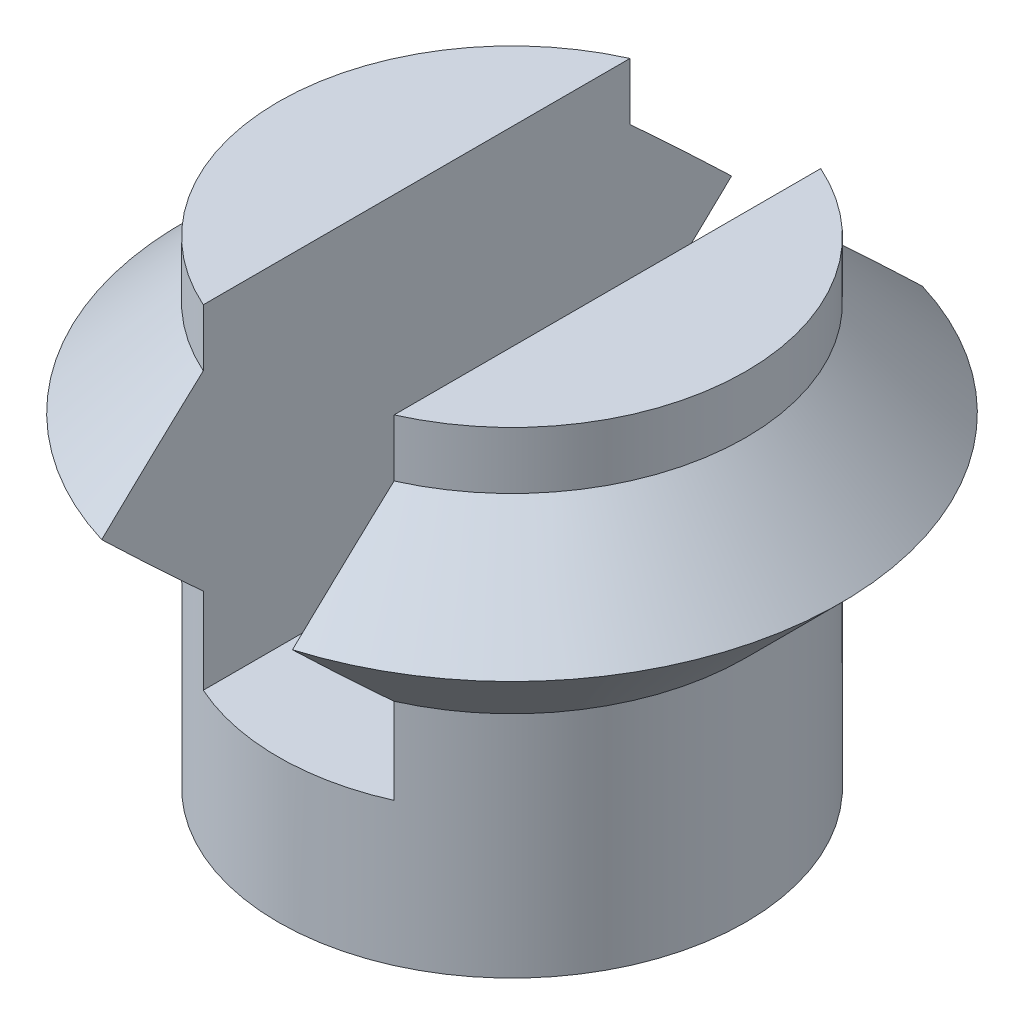
ISO-10303-21;
HEADER;
FILE_DESCRIPTION(('STEP AP214'),'2;1');
FILE_NAME('part.step','',(''),(''),'','','');
FILE_SCHEMA(('AUTOMOTIVE_DESIGN { 1 0 10303 214 1 1 1 1 }'));
ENDSEC;
DATA;
#1=APPLICATION_CONTEXT('core data for automotive mechanical design processes');
#2=APPLICATION_PROTOCOL_DEFINITION('international standard','automotive_design',2000,#1);
#3=PRODUCT_CONTEXT('',#1,'mechanical');
#4=PRODUCT('Part','Part','',(#3));
#5=PRODUCT_RELATED_PRODUCT_CATEGORY('part','',(#4));
#6=PRODUCT_DEFINITION_FORMATION('','',#4);
#7=PRODUCT_DEFINITION_CONTEXT('part definition',#1,'design');
#8=PRODUCT_DEFINITION('design','',#6,#7);
#9=PRODUCT_DEFINITION_SHAPE('','',#8);
#10=(LENGTH_UNIT() NAMED_UNIT(*) SI_UNIT(.MILLI.,.METRE.));
#11=(NAMED_UNIT(*) PLANE_ANGLE_UNIT() SI_UNIT($,.RADIAN.));
#12=(NAMED_UNIT(*) SI_UNIT($,.STERADIAN.) SOLID_ANGLE_UNIT());
#13=UNCERTAINTY_MEASURE_WITH_UNIT(LENGTH_MEASURE(1.E-05),#10,'distance_accuracy_value','');
#14=(GEOMETRIC_REPRESENTATION_CONTEXT(3) GLOBAL_UNCERTAINTY_ASSIGNED_CONTEXT((#13)) GLOBAL_UNIT_ASSIGNED_CONTEXT((#10,
#11,#12)) REPRESENTATION_CONTEXT('',''));
#15=CARTESIAN_POINT('',(0.,0.,0.));
#16=DIRECTION('',(0.,0.,1.));
#17=DIRECTION('',(1.,0.,0.));
#18=AXIS2_PLACEMENT_3D('',#15,#16,#17);
#19=CARTESIAN_POINT('',(0.,6.80000000000001,0.));
#20=DIRECTION('',(0.,1.,0.));
#21=DIRECTION('',(0.,0.,1.));
#22=AXIS2_PLACEMENT_3D('',#19,#20,#21);
#23=CONICAL_SURFACE('',#22,6.9,0.78539816339745);
#24=CARTESIAN_POINT('',(0.,6.80000000000001,0.));
#25=DIRECTION('',(0.,-1.,0.));
#26=DIRECTION('',(0.,0.,-1.));
#27=AXIS2_PLACEMENT_3D('',#24,#25,#26);
#28=CIRCLE('',#27,6.9);
#29=CARTESIAN_POINT('',(-2.,6.80000000000001,6.60378679243962));
#30=VERTEX_POINT('',#29);
#31=CARTESIAN_POINT('',(-2.,6.80000000000001,-6.60378679243962));
#32=VERTEX_POINT('',#31);
#33=EDGE_CURVE('E217',#30,#32,#28,.T.);
#34=ORIENTED_EDGE('',*,*,#33,.T.);
#35=CARTESIAN_POINT('',(-2.,15.1667046465056,-15.1351336552948));
#36=CARTESIAN_POINT('',(-2.,14.7150856370467,-14.6795690612317));
#37=CARTESIAN_POINT('',(-2.,14.2636244457039,-14.2238476741489));
#38=CARTESIAN_POINT('',(-2.,13.361023948662,-13.3117848491264));
#39=CARTESIAN_POINT('',(-2.,12.9098848009211,-12.855443254885));
#40=CARTESIAN_POINT('',(-2.,12.0052993208266,-11.9391624752148));
#41=CARTESIAN_POINT('',(-2.,11.5518571075783,-11.4792192221261));
#42=CARTESIAN_POINT('',(-2.,10.6460268222053,-10.5585938410006));
#43=CARTESIAN_POINT('',(-2.,10.1936384516684,-10.0979120067777));
#44=CARTESIAN_POINT('',(-2.,9.44470472555075,-9.33301483473547));
#45=CARTESIAN_POINT('',(-2.,9.14777698618228,-9.02917401035082));
#46=CARTESIAN_POINT('',(-2.,8.55469841867743,-8.42071497562212));
#47=CARTESIAN_POINT('',(-2.,8.25854761675697,-8.1160967397133));
#48=CARTESIAN_POINT('',(-2.,7.66699831504636,-7.50546629512606));
#49=CARTESIAN_POINT('',(-2.,7.37160103318321,-7.19945290537576));
#50=CARTESIAN_POINT('',(-2.,6.78240847371216,-6.5859592730742));
#51=CARTESIAN_POINT('',(-2.,6.4886130030596,-6.27847921604665));
#52=CARTESIAN_POINT('',(-2.,5.90482826308767,-5.66282565089931));
#53=CARTESIAN_POINT('',(-2.,5.61482731753986,-5.35466325431054));
#54=CARTESIAN_POINT('',(-2.,5.18260307227663,-4.8896937025429));
#55=CARTESIAN_POINT('',(-2.,5.03895618484502,-4.73421093482731));
#56=CARTESIAN_POINT('',(-2.,4.75293193987242,-4.42208898904778));
#57=CARTESIAN_POINT('',(-2.,4.61055454443579,-4.26544984575973));
#58=CARTESIAN_POINT('',(-2.,4.32779292318295,-3.95096022327327));
#59=CARTESIAN_POINT('',(-2.,4.18740520326479,-3.79311289407295));
#60=CARTESIAN_POINT('',(-2.,3.90900655331902,-3.4753427905065));
#61=CARTESIAN_POINT('',(-2.,3.77099553026041,-3.31542009780795));
#62=CARTESIAN_POINT('',(-2.,3.49850113401099,-2.99277935424726));
#63=CARTESIAN_POINT('',(-2.,3.36401516479595,-2.83006351539912));
#64=CARTESIAN_POINT('',(-2.,3.16627778419773,-2.58282474513809));
#65=CARTESIAN_POINT('',(-2.,3.10103763428536,-2.49989373786977));
#66=CARTESIAN_POINT('',(-2.,2.97225578904721,-2.33272567338343));
#67=CARTESIAN_POINT('',(-2.,2.90871398004942,-2.24848870417431));
#68=CARTESIAN_POINT('',(-2.,2.80927658709553,-2.11306758551633));
#69=CARTESIAN_POINT('',(-2.,2.77266913501638,-2.06240610619401));
#70=CARTESIAN_POINT('',(-2.,2.70035889571104,-1.96043456389808));
#71=CARTESIAN_POINT('',(-2.,2.6646561772389,-1.90912445207396));
#72=CARTESIAN_POINT('',(-2.,2.59430721673122,-1.80574853878673));
#73=CARTESIAN_POINT('',(-2.,2.5596614598574,-1.75368240601317));
#74=CARTESIAN_POINT('',(-2.,2.49165576865392,-1.64871860451781));
#75=CARTESIAN_POINT('',(-2.,2.45829582095442,-1.59582094445028));
#76=CARTESIAN_POINT('',(-2.,2.36109553420224,-1.43667773055028));
#77=CARTESIAN_POINT('',(-2.,2.29948760566857,-1.32904688773807));
#78=CARTESIAN_POINT('',(-2.,2.18506406157412,-1.10919517211108));
#79=CARTESIAN_POINT('',(-2.,2.1322401221402,-0.996978771761734));
#80=CARTESIAN_POINT('',(-2.,2.06168224931713,-0.822113755703881));
#81=CARTESIAN_POINT('',(-2.,2.03923425287328,-0.761372158070978));
#82=CARTESIAN_POINT('',(-2.,1.99863400064978,-0.638459022769048));
#83=CARTESIAN_POINT('',(-2.,1.98048115165605,-0.576287683868227));
#84=CARTESIAN_POINT('',(-2.,1.94930835313774,-0.450922835791378));
#85=CARTESIAN_POINT('',(-2.,1.93626777251975,-0.387734529251018));
#86=CARTESIAN_POINT('',(-2.,1.91590922597701,-0.260446332863324));
#87=CARTESIAN_POINT('',(-2.,1.90858954744945,-0.196346721678187));
#88=CARTESIAN_POINT('',(-2.,1.90007875866502,-0.0671336325484307));
#89=CARTESIAN_POINT('',(-2.,1.89894537718034,-0.00201627248230862));
#90=CARTESIAN_POINT('',(-2.,1.9030385519743,0.128013769397145));
#91=CARTESIAN_POINT('',(-2.,1.90826509771208,0.192926451549528));
#92=CARTESIAN_POINT('',(-2.,1.92476217624417,0.32215513918275));
#93=CARTESIAN_POINT('',(-2.,1.93604997685992,0.386468903220727));
#94=CARTESIAN_POINT('',(-2.,1.9640313421764,0.513901478993359));
#95=CARTESIAN_POINT('',(-2.,1.98072611283985,0.577020020820064));
#96=CARTESIAN_POINT('',(-2.,2.02857814864549,0.734160002513812));
#97=CARTESIAN_POINT('',(-2.,2.0627480301801,0.827260866522708));
#98=CARTESIAN_POINT('',(-2.,2.13906525772123,1.0101177721675));
#99=CARTESIAN_POINT('',(-2.,2.18121880137968,1.0998711499529));
#100=CARTESIAN_POINT('',(-2.,2.27158097614077,1.27679582189279));
#101=CARTESIAN_POINT('',(-2.,2.31981822281024,1.36395233477823));
#102=CARTESIAN_POINT('',(-2.,2.39540764979363,1.49273583749728));
#103=CARTESIAN_POINT('',(-2.,2.42113847369554,1.53533149315963));
#104=CARTESIAN_POINT('',(-2.,2.47353886670777,1.61993984283277));
#105=CARTESIAN_POINT('',(-2.,2.50020839712506,1.66195256077266));
#106=CARTESIAN_POINT('',(-2.,2.59139304726558,1.80257592237418));
#107=CARTESIAN_POINT('',(-2.,2.65776686673849,1.89998216304141));
#108=CARTESIAN_POINT('',(-2.,2.79377424457639,2.09250038928564));
#109=CARTESIAN_POINT('',(-2.,2.86340855287117,2.18761183935018));
#110=CARTESIAN_POINT('',(-2.,3.00514100948004,2.37608116005309));
#111=CARTESIAN_POINT('',(-2.,3.07724088039446,2.46943773101304));
#112=CARTESIAN_POINT('',(-2.,3.22328265914155,2.65470183452909));
#113=CARTESIAN_POINT('',(-2.,3.29722467654048,2.74660928036144));
#114=CARTESIAN_POINT('',(-2.,3.52153196859118,3.02104403628402));
#115=CARTESIAN_POINT('',(-2.,3.6740283051981,3.20182719050011));
#116=CARTESIAN_POINT('',(-2.,3.98251934300527,3.56022434907797));
#117=CARTESIAN_POINT('',(-2.,4.13851254970165,3.73783965117002));
#118=CARTESIAN_POINT('',(-2.,4.45348744685648,4.09154499807357));
#119=CARTESIAN_POINT('',(-2.,4.6124778767382,4.26762724622491));
#120=CARTESIAN_POINT('',(-2.,4.93219339793642,4.61823896084283));
#121=CARTESIAN_POINT('',(-2.,5.09291866660812,4.79276826515769));
#122=CARTESIAN_POINT('',(-2.,5.41537801559268,5.14038923130749));
#123=CARTESIAN_POINT('',(-2.,5.57711015134822,5.31348269905899));
#124=CARTESIAN_POINT('',(-2.,5.90151807793165,5.65877127719236));
#125=CARTESIAN_POINT('',(-2.,6.06419383723615,5.83096641722356));
#126=CARTESIAN_POINT('',(-2.,6.59699801540357,6.3925837238781));
#127=CARTESIAN_POINT('',(-2.,6.96862027413361,6.78058798889298));
#128=CARTESIAN_POINT('',(-2.,7.71406523793303,7.55448536461382));
#129=CARTESIAN_POINT('',(-2.,8.08788798649622,7.94037843329806));
#130=CARTESIAN_POINT('',(-2.,8.83721578972919,8.71102328978274));
#131=CARTESIAN_POINT('',(-2.,9.21272179262976,9.0957741552067));
#132=CARTESIAN_POINT('',(-2.,9.96471129867632,9.86431321823452));
#133=CARTESIAN_POINT('',(-2.,10.3411947947436,10.2481014227704));
#134=CARTESIAN_POINT('',(-2.,11.0879229207067,11.0079267853776));
#135=CARTESIAN_POINT('',(-2.,11.4581547563287,11.3839765209517));
#136=CARTESIAN_POINT('',(-2.,12.1991213682711,12.1355818100509));
#137=CARTESIAN_POINT('',(-2.,12.5698561457917,12.5111373623924));
#138=CARTESIAN_POINT('',(-2.,13.3114410340201,13.2616013855071));
#139=CARTESIAN_POINT('',(-2.,13.6822908704908,13.6365101273277));
#140=CARTESIAN_POINT('',(-2.,14.4242915220647,14.3860273514082));
#141=CARTESIAN_POINT('',(-2.,14.7954423362231,14.7606358346032));
#142=CARTESIAN_POINT('',(-2.,15.1667046465056,15.1351336552948));
#143=B_SPLINE_CURVE_WITH_KNOTS('',3,(#35,#36,#37,#38,#39,#40,#41,#42,#43,#44,#45,#46,#47,#48,
#49,#50,#51,#52,#53,#54,#55,#56,#57,#58,#59,#60,#61,#62,#63,#64,#65,#66,#67,#68,#69,#70,#71,#72,
#73,#74,#75,#76,#77,#78,#79,#80,#81,#82,#83,#84,#85,#86,#87,#88,#89,#90,#91,#92,#93,#94,#95,#96,
#97,#98,#99,#100,#101,#102,#103,#104,#105,#106,#107,#108,#109,#110,#111,#112,#113,#114,#115,
#116,#117,#118,#119,#120,#121,#122,#123,#124,#125,#126,#127,#128,#129,#130,#131,#132,#133,#134,
#135,#136,#137,#138,#139,#140,#141,#142),.UNSPECIFIED.,.F.,.F.,(4,2,2,2,2,2,2,2,2,2,2,2,2,2,2,2,
2,2,2,2,2,2,2,2,2,2,2,2,2,2,2,2,2,2,2,2,2,2,2,2,2,2,2,2,2,2,2,2,2,2,2,2,2,4),(0.,
1.92444557057963,3.84953416931929,5.78716564220994,7.7241578877905,8.99866380378857,
10.2732121856627,11.5491915322973,12.825013543663,14.0944709241329,14.7295121850532,
15.3645344254346,15.9982519649411,16.631944642211,17.2651567203758,17.5816922175637,
17.8982064753221,18.085709005424,18.2732257420621,18.4608272948494,18.6484268964287,
19.0202190869609,19.3916569273171,19.5858003237708,19.7799168908988,19.9732418112275,
20.1665088358353,20.361576328979,20.556643498821,20.7522693641712,20.9479388917113,
21.2449201527697,21.5421329099969,21.8407997839128,21.9900832478731,22.1393605656338,
22.4928665387704,22.8464542234453,23.2002942078968,23.5541552883474,24.2636027638492,
24.972752605871,25.6844563582789,26.3962335716568,27.1069100076004,27.8175628373358,
29.4293308786727,31.041130885123,32.6539956911034,34.2668488495261,35.8499986023714,
37.4331521404435,39.0151682287336,40.597179370212),.UNSPECIFIED.);
#144=CARTESIAN_POINT('',(-2.,4.80000000000001,-4.47325384926901));
#145=VERTEX_POINT('',#144);
#146=EDGE_CURVE('E189',#32,#145,#143,.T.);
#147=ORIENTED_EDGE('',*,*,#146,.T.);
#148=CARTESIAN_POINT('',(0.,4.80000000000001,0.));
#149=DIRECTION('',(0.,-1.,0.));
#150=DIRECTION('',(0.,0.,-1.));
#151=AXIS2_PLACEMENT_3D('',#148,#149,#150);
#152=CIRCLE('',#151,4.9);
#153=CARTESIAN_POINT('',(-2.,4.80000000000009,4.47325384926914));
#154=VERTEX_POINT('',#153);
#155=EDGE_CURVE('E224',#154,#145,#152,.T.);
#156=ORIENTED_EDGE('',*,*,#155,.F.);
#157=EDGE_CURVE('E116',#154,#30,#143,.T.);
#158=ORIENTED_EDGE('',*,*,#157,.T.);
#159=EDGE_LOOP('',(#34,#147,#156,#158));
#160=FACE_BOUND('',#159,.T.);
#161=ADVANCED_FACE('F35',(#160),#23,.T.);
#162=CARTESIAN_POINT('',(0.,8.8,0.));
#163=DIRECTION('',(0.,-1.,0.));
#164=DIRECTION('',(0.,0.,-1.));
#165=AXIS2_PLACEMENT_3D('',#162,#163,#164);
#166=CONICAL_SURFACE('',#165,4.9,0.78539816339745);
#167=ORIENTED_EDGE('',*,*,#33,.F.);
#168=CARTESIAN_POINT('',(-2.,-1.56670464650561,15.1351336552948));
#169=CARTESIAN_POINT('',(-2.,-1.11508563704666,14.6795690612317));
#170=CARTESIAN_POINT('',(-2.,-0.663624445703908,14.2238476741489));
#171=CARTESIAN_POINT('',(-2.,0.23897605133806,13.3117848491264));
#172=CARTESIAN_POINT('',(-2.,0.690115199078942,12.855443254885));
#173=CARTESIAN_POINT('',(-2.,1.59470067917339,11.9391624752148));
#174=CARTESIAN_POINT('',(-2.,2.04814289242173,11.4792192221261));
#175=CARTESIAN_POINT('',(-2.,2.95397317779471,10.5585938410006));
#176=CARTESIAN_POINT('',(-2.,3.40636154833162,10.0979120067777));
#177=CARTESIAN_POINT('',(-2.,4.15529527444926,9.33301483473548));
#178=CARTESIAN_POINT('',(-2.,4.45222301381773,9.02917401035082));
#179=CARTESIAN_POINT('',(-2.,5.04530158132258,8.42071497562212));
#180=CARTESIAN_POINT('',(-2.,5.34145238324304,8.1160967397133));
#181=CARTESIAN_POINT('',(-2.,5.93300168495365,7.50546629512606));
#182=CARTESIAN_POINT('',(-2.,6.2283989668168,7.19945290537576));
#183=CARTESIAN_POINT('',(-2.,6.81759152628786,6.5859592730742));
#184=CARTESIAN_POINT('',(-2.,7.11138699694041,6.27847921604666));
#185=CARTESIAN_POINT('',(-2.,7.69517173691234,5.66282565089932));
#186=CARTESIAN_POINT('',(-2.,7.98517268246015,5.35466325431054));
#187=CARTESIAN_POINT('',(-2.,8.41739692772338,4.8896937025429));
#188=CARTESIAN_POINT('',(-2.,8.561043815155,4.73421093482732));
#189=CARTESIAN_POINT('',(-2.,8.84706806012759,4.42208898904779));
#190=CARTESIAN_POINT('',(-2.,8.98944545556423,4.26544984575973));
#191=CARTESIAN_POINT('',(-2.,9.27220707681706,3.95096022327328));
#192=CARTESIAN_POINT('',(-2.,9.41259479673523,3.79311289407295));
#193=CARTESIAN_POINT('',(-2.,9.690993446681,3.4753427905065));
#194=CARTESIAN_POINT('',(-2.,9.82900446973961,3.31542009780795));
#195=CARTESIAN_POINT('',(-2.,10.101498865989,2.99277935424726));
#196=CARTESIAN_POINT('',(-2.,10.2359848352041,2.83006351539912));
#197=CARTESIAN_POINT('',(-2.,10.4337222158023,2.58282474513809));
#198=CARTESIAN_POINT('',(-2.,10.4989623657147,2.49989373786977));
#199=CARTESIAN_POINT('',(-2.,10.6277442109528,2.33272567338343));
#200=CARTESIAN_POINT('',(-2.,10.6912860199506,2.24848870417431));
#201=CARTESIAN_POINT('',(-2.,10.7907234129045,2.11306758551633));
#202=CARTESIAN_POINT('',(-2.,10.8273308649836,2.06240610619401));
#203=CARTESIAN_POINT('',(-2.,10.899641104289,1.96043456389808));
#204=CARTESIAN_POINT('',(-2.,10.9353438227611,1.90912445207396));
#205=CARTESIAN_POINT('',(-2.,11.0056927832688,1.80574853878673));
#206=CARTESIAN_POINT('',(-2.,11.0403385401426,1.75368240601317));
#207=CARTESIAN_POINT('',(-2.,11.1083442313461,1.64871860451781));
#208=CARTESIAN_POINT('',(-2.,11.1417041790456,1.59582094445028));
#209=CARTESIAN_POINT('',(-2.,11.2389044657978,1.43667773055028));
#210=CARTESIAN_POINT('',(-2.,11.3005123943315,1.32904688773807));
#211=CARTESIAN_POINT('',(-2.,11.4149359384259,1.10919517211108));
#212=CARTESIAN_POINT('',(-2.,11.4677598778598,0.996978771761732));
#213=CARTESIAN_POINT('',(-2.,11.5383177506829,0.822113755703879));
#214=CARTESIAN_POINT('',(-2.,11.5607657471267,0.761372158070976));
#215=CARTESIAN_POINT('',(-2.,11.6013659993502,0.638459022769045));
#216=CARTESIAN_POINT('',(-2.,11.619518848344,0.576287683868223));
#217=CARTESIAN_POINT('',(-2.,11.6506916468623,0.450922835791376));
#218=CARTESIAN_POINT('',(-2.,11.6637322274803,0.387734529251018));
#219=CARTESIAN_POINT('',(-2.,11.684090774023,0.260446332863325));
#220=CARTESIAN_POINT('',(-2.,11.6914104525506,0.196346721678187));
#221=CARTESIAN_POINT('',(-2.,11.699921241335,0.0671336325484303));
#222=CARTESIAN_POINT('',(-2.,11.7010546228197,0.00201627248230819));
#223=CARTESIAN_POINT('',(-2.,11.6969614480257,-0.128013769397145));
#224=CARTESIAN_POINT('',(-2.,11.6917349022879,-0.192926451549529));
#225=CARTESIAN_POINT('',(-2.,11.6752378237558,-0.322155139182749));
#226=CARTESIAN_POINT('',(-2.,11.6639500231401,-0.386468903220724));
#227=CARTESIAN_POINT('',(-2.,11.6359686578236,-0.513901478993357));
#228=CARTESIAN_POINT('',(-2.,11.6192738871602,-0.577020020820063));
#229=CARTESIAN_POINT('',(-2.,11.5714218513545,-0.734160002513812));
#230=CARTESIAN_POINT('',(-2.,11.5372519698199,-0.827260866522708));
#231=CARTESIAN_POINT('',(-2.,11.4609347422788,-1.0101177721675));
#232=CARTESIAN_POINT('',(-2.,11.4187811986203,-1.0998711499529));
#233=CARTESIAN_POINT('',(-2.,11.3284190238592,-1.27679582189279));
#234=CARTESIAN_POINT('',(-2.,11.2801817771898,-1.36395233477823));
#235=CARTESIAN_POINT('',(-2.,11.2045923502064,-1.49273583749728));
#236=CARTESIAN_POINT('',(-2.,11.1788615263045,-1.53533149315963));
#237=CARTESIAN_POINT('',(-2.,11.1264611332923,-1.61993984283276));
#238=CARTESIAN_POINT('',(-2.,11.099791602875,-1.66195256077266));
#239=CARTESIAN_POINT('',(-2.,11.0086069527344,-1.80257592237417));
#240=CARTESIAN_POINT('',(-2.,10.9422331332615,-1.89998216304141));
#241=CARTESIAN_POINT('',(-2.,10.8062257554236,-2.09250038928564));
#242=CARTESIAN_POINT('',(-2.,10.7365914471288,-2.18761183935018));
#243=CARTESIAN_POINT('',(-2.,10.59485899052,-2.37608116005309));
#244=CARTESIAN_POINT('',(-2.,10.5227591196056,-2.46943773101304));
#245=CARTESIAN_POINT('',(-2.,10.3767173408585,-2.65470183452909));
#246=CARTESIAN_POINT('',(-2.,10.3027753234595,-2.74660928036145));
#247=CARTESIAN_POINT('',(-2.,10.0784680314088,-3.02104403628402));
#248=CARTESIAN_POINT('',(-2.,9.92597169480191,-3.20182719050011));
#249=CARTESIAN_POINT('',(-2.,9.61748065699474,-3.56022434907797));
#250=CARTESIAN_POINT('',(-2.,9.46148745029837,-3.73783965117002));
#251=CARTESIAN_POINT('',(-2.,9.14651255314354,-4.09154499807357));
#252=CARTESIAN_POINT('',(-2.,8.98752212326182,-4.2676272462249));
#253=CARTESIAN_POINT('',(-2.,8.6678066020636,-4.61823896084283));
#254=CARTESIAN_POINT('',(-2.,8.5070813333919,-4.79276826515769));
#255=CARTESIAN_POINT('',(-2.,8.18462198440734,-5.14038923130748));
#256=CARTESIAN_POINT('',(-2.,8.0228898486518,-5.31348269905898));
#257=CARTESIAN_POINT('',(-2.,7.69848192206837,-5.65877127719235));
#258=CARTESIAN_POINT('',(-2.,7.53580616276387,-5.83096641722355));
#259=CARTESIAN_POINT('',(-2.,7.00300198459645,-6.39258372387809));
#260=CARTESIAN_POINT('',(-2.,6.63137972586642,-6.78058798889297));
#261=CARTESIAN_POINT('',(-2.,5.885934762067,-7.55448536461381));
#262=CARTESIAN_POINT('',(-2.,5.5121120135038,-7.94037843329805));
#263=CARTESIAN_POINT('',(-2.,4.76278421027083,-8.71102328978272));
#264=CARTESIAN_POINT('',(-2.,4.38727820737027,-9.09577415520669));
#265=CARTESIAN_POINT('',(-2.,3.6352887013237,-9.86431321823451));
#266=CARTESIAN_POINT('',(-2.,3.25880520525646,-10.2481014227704));
#267=CARTESIAN_POINT('',(-2.,2.51207707929328,-11.0079267853776));
#268=CARTESIAN_POINT('',(-2.,2.14184524367127,-11.3839765209517));
#269=CARTESIAN_POINT('',(-2.,1.40087863172897,-12.1355818100509));
#270=CARTESIAN_POINT('',(-2.,1.03014385420828,-12.5111373623924));
#271=CARTESIAN_POINT('',(-2.,0.288558965979923,-13.2616013855071));
#272=CARTESIAN_POINT('',(-2.,-0.0822908704907378,-13.6365101273277));
#273=CARTESIAN_POINT('',(-2.,-0.824291522064645,-14.3860273514082));
#274=CARTESIAN_POINT('',(-2.,-1.19544233622313,-14.7606358346032));
#275=CARTESIAN_POINT('',(-2.,-1.56670464650561,-15.1351336552948));
#276=B_SPLINE_CURVE_WITH_KNOTS('',3,(#168,#169,#170,#171,#172,#173,#174,#175,#176,#177,#178,
#179,#180,#181,#182,#183,#184,#185,#186,#187,#188,#189,#190,#191,#192,#193,#194,#195,#196,#197,
#198,#199,#200,#201,#202,#203,#204,#205,#206,#207,#208,#209,#210,#211,#212,#213,#214,#215,#216,
#217,#218,#219,#220,#221,#222,#223,#224,#225,#226,#227,#228,#229,#230,#231,#232,#233,#234,#235,
#236,#237,#238,#239,#240,#241,#242,#243,#244,#245,#246,#247,#248,#249,#250,#251,#252,#253,#254,
#255,#256,#257,#258,#259,#260,#261,#262,#263,#264,#265,#266,#267,#268,#269,#270,#271,#272,#273,
#274,#275),.UNSPECIFIED.,.F.,.F.,(4,2,2,2,2,2,2,2,2,2,2,2,2,2,2,2,2,2,2,2,2,2,2,2,2,2,2,2,2,2,2,
2,2,2,2,2,2,2,2,2,2,2,2,2,2,2,2,2,2,2,2,2,2,4),(0.,1.92444557057962,3.84953416931928,
5.78716564220993,7.72415788779048,8.99866380378855,10.2732121856627,11.5491915322973,
12.825013543663,14.0944709241329,14.7295121850532,15.3645344254345,15.9982519649411,
16.631944642211,17.2651567203758,17.5816922175637,17.8982064753221,18.085709005424,
18.2732257420621,18.4608272948494,18.6484268964287,19.0202190869609,19.3916569273171,
19.5858003237708,19.7799168908988,19.9732418112275,20.1665088358352,20.361576328979,
20.556643498821,20.7522693641712,20.9479388917113,21.2449201527697,21.5421329099969,
21.8407997839128,21.9900832478731,22.1393605656338,22.4928665387704,22.8464542234453,
23.2002942078968,23.5541552883474,24.2636027638492,24.972752605871,25.6844563582789,
26.3962335716568,27.1069100076003,27.8175628373358,29.4293308786727,31.041130885123,
32.6539956911034,34.2668488495261,35.8499986023714,37.4331521404435,39.0151682287335,
40.597179370212),.UNSPECIFIED.);
#277=CARTESIAN_POINT('',(-2.,8.8,4.47325384926901));
#278=VERTEX_POINT('',#277);
#279=EDGE_CURVE('E178',#30,#278,#276,.T.);
#280=ORIENTED_EDGE('',*,*,#279,.T.);
#281=CARTESIAN_POINT('',(0.,8.8,0.));
#282=DIRECTION('',(0.,-1.,0.));
#283=DIRECTION('',(0.,0.,-1.));
#284=AXIS2_PLACEMENT_3D('',#281,#282,#283);
#285=CIRCLE('',#284,4.9);
#286=CARTESIAN_POINT('',(-2.,8.8,-4.47325384926901));
#287=VERTEX_POINT('',#286);
#288=EDGE_CURVE('E226',#278,#287,#285,.T.);
#289=ORIENTED_EDGE('',*,*,#288,.T.);
#290=EDGE_CURVE('E235',#287,#32,#276,.T.);
#291=ORIENTED_EDGE('',*,*,#290,.T.);
#292=EDGE_LOOP('',(#167,#280,#289,#291));
#293=FACE_BOUND('',#292,.T.);
#294=ADVANCED_FACE('F208',(#293),#166,.T.);
#295=CARTESIAN_POINT('',(0.,0.,0.));
#296=DIRECTION('',(0.,-1.,0.));
#297=DIRECTION('',(0.,0.,-1.));
#298=AXIS2_PLACEMENT_3D('',#295,#296,#297);
#299=CYLINDRICAL_SURFACE('',#298,4.9);
#300=CARTESIAN_POINT('',(0.,10.,0.));
#301=DIRECTION('',(0.,-1.,0.));
#302=DIRECTION('',(0.,0.,-1.));
#303=AXIS2_PLACEMENT_3D('',#300,#301,#302);
#304=CIRCLE('',#303,4.9);
#305=CARTESIAN_POINT('',(-2.,10.,4.47325384926901));
#306=VERTEX_POINT('',#305);
#307=CARTESIAN_POINT('',(-2.,10.,-4.47325384926901));
#308=VERTEX_POINT('',#307);
#309=EDGE_CURVE('E231',#306,#308,#304,.T.);
#310=ORIENTED_EDGE('',*,*,#309,.T.);
#311=DIRECTION('',(0.,-1.,0.));
#312=VECTOR('',#311,1.);
#313=CARTESIAN_POINT('',(-2.,0.,-4.47325384926901));
#314=LINE('',#313,#312);
#315=EDGE_CURVE('E121',#308,#287,#314,.T.);
#316=ORIENTED_EDGE('',*,*,#315,.T.);
#317=ORIENTED_EDGE('',*,*,#288,.F.);
#318=DIRECTION('',(0.,-1.,0.));
#319=VECTOR('',#318,1.);
#320=CARTESIAN_POINT('',(-2.,0.,4.47325384926901));
#321=LINE('',#320,#319);
#322=EDGE_CURVE('E244',#278,#306,#321,.F.);
#323=ORIENTED_EDGE('',*,*,#322,.T.);
#324=EDGE_LOOP('',(#310,#316,#317,#323));
#325=FACE_BOUND('',#324,.T.);
#326=ADVANCED_FACE('F213',(#325),#299,.T.);
#327=CARTESIAN_POINT('',(-4.9,10.,0.));
#328=DIRECTION('',(0.,-1.,0.));
#329=DIRECTION('',(0.,0.,-1.));
#330=AXIS2_PLACEMENT_3D('',#327,#328,#329);
#331=PLANE('',#330);
#332=ORIENTED_EDGE('',*,*,#309,.F.);
#333=DIRECTION('',(0.,0.,1.));
#334=VECTOR('',#333,1.);
#335=CARTESIAN_POINT('',(-2.,10.,-6.9));
#336=LINE('',#335,#334);
#337=EDGE_CURVE('E259',#308,#306,#336,.T.);
#338=ORIENTED_EDGE('',*,*,#337,.F.);
#339=EDGE_LOOP('',(#332,#338));
#340=FACE_BOUND('',#339,.T.);
#341=ADVANCED_FACE('F204',(#340),#331,.F.);
#342=CARTESIAN_POINT('',(0.,3.,0.));
#343=DIRECTION('',(0.,-1.,0.));
#344=DIRECTION('',(0.,0.,-1.));
#345=AXIS2_PLACEMENT_3D('',#342,#343,#344);
#346=CYLINDRICAL_SURFACE('',#345,4.9);
#347=ORIENTED_EDGE('',*,*,#155,.T.);
#348=DIRECTION('',(0.,-1.,0.));
#349=VECTOR('',#348,1.);
#350=CARTESIAN_POINT('',(-2.,3.,-4.47325384926901));
#351=LINE('',#350,#349);
#352=CARTESIAN_POINT('',(-2.,3.,-4.47325384926901));
#353=VERTEX_POINT('',#352);
#354=EDGE_CURVE('E58',#145,#353,#351,.T.);
#355=ORIENTED_EDGE('',*,*,#354,.T.);
#356=CARTESIAN_POINT('',(0.,3.,0.));
#357=DIRECTION('',(0.,1.,0.));
#358=DIRECTION('',(0.,0.,1.));
#359=AXIS2_PLACEMENT_3D('',#356,#357,#358);
#360=CIRCLE('',#359,4.9);
#361=CARTESIAN_POINT('',(2.,3.,-4.47325384926901));
#362=VERTEX_POINT('',#361);
#363=EDGE_CURVE('E129',#362,#353,#360,.T.);
#364=ORIENTED_EDGE('',*,*,#363,.F.);
#365=DIRECTION('',(0.,-1.,0.));
#366=VECTOR('',#365,1.);
#367=CARTESIAN_POINT('',(2.,3.,-4.47325384926901));
#368=LINE('',#367,#366);
#369=CARTESIAN_POINT('',(2.,4.80000000000009,-4.47325384926914));
#370=VERTEX_POINT('',#369);
#371=EDGE_CURVE('E250',#362,#370,#368,.F.);
#372=ORIENTED_EDGE('',*,*,#371,.T.);
#373=CARTESIAN_POINT('',(2.,4.80000000000001,4.47325384926901));
#374=VERTEX_POINT('',#373);
#375=EDGE_CURVE('E43',#370,#374,#152,.T.);
#376=ORIENTED_EDGE('',*,*,#375,.T.);
#377=DIRECTION('',(0.,-1.,0.));
#378=VECTOR('',#377,1.);
#379=CARTESIAN_POINT('',(2.,3.,4.47325384926901));
#380=LINE('',#379,#378);
#381=CARTESIAN_POINT('',(2.,3.,4.47325384926901));
#382=VERTEX_POINT('',#381);
#383=EDGE_CURVE('E135',#374,#382,#380,.T.);
#384=ORIENTED_EDGE('',*,*,#383,.T.);
#385=CARTESIAN_POINT('',(-2.,3.,4.47325384926901));
#386=VERTEX_POINT('',#385);
#387=EDGE_CURVE('E126',#386,#382,#360,.T.);
#388=ORIENTED_EDGE('',*,*,#387,.F.);
#389=DIRECTION('',(0.,-1.,0.));
#390=VECTOR('',#389,1.);
#391=CARTESIAN_POINT('',(-2.,3.,4.47325384926901));
#392=LINE('',#391,#390);
#393=EDGE_CURVE('E111',#386,#154,#392,.F.);
#394=ORIENTED_EDGE('',*,*,#393,.T.);
#395=EDGE_LOOP('',(#347,#355,#364,#372,#376,#384,#388,#394));
#396=FACE_BOUND('',#395,.T.);
#397=CARTESIAN_POINT('',(0.,0.,0.));
#398=DIRECTION('',(0.,1.,0.));
#399=DIRECTION('',(0.,0.,1.));
#400=AXIS2_PLACEMENT_3D('',#397,#398,#399);
#401=CIRCLE('',#400,4.9);
#402=CARTESIAN_POINT('',(0.,0.,4.9));
#403=VERTEX_POINT('',#402);
#404=EDGE_CURVE('E11',#403,#403,#401,.T.);
#405=ORIENTED_EDGE('',*,*,#404,.T.);
#406=EDGE_LOOP('',(#405));
#407=FACE_BOUND('',#406,.T.);
#408=ADVANCED_FACE('F37',(#396,#407),#346,.T.);
#409=CARTESIAN_POINT('',(0.,0.,0.));
#410=DIRECTION('',(0.,1.,0.));
#411=DIRECTION('',(0.,0.,1.));
#412=AXIS2_PLACEMENT_3D('',#409,#410,#411);
#413=PLANE('',#412);
#414=CARTESIAN_POINT('',(0.,0.,0.));
#415=DIRECTION('',(0.,-1.,0.));
#416=DIRECTION('',(0.,0.,-1.));
#417=AXIS2_PLACEMENT_3D('',#414,#415,#416);
#418=CIRCLE('',#417,2.6);
#419=CARTESIAN_POINT('',(0.,0.,-2.6));
#420=VERTEX_POINT('',#419);
#421=EDGE_CURVE('E263',#420,#420,#418,.T.);
#422=ORIENTED_EDGE('',*,*,#421,.F.);
#423=EDGE_LOOP('',(#422));
#424=FACE_BOUND('',#423,.T.);
#425=ORIENTED_EDGE('',*,*,#404,.F.);
#426=EDGE_LOOP('',(#425));
#427=FACE_BOUND('',#426,.T.);
#428=ADVANCED_FACE('F195',(#424,#427),#413,.F.);
#429=CARTESIAN_POINT('',(2.,6.80000000000001,-6.60378679243962));
#430=VERTEX_POINT('',#429);
#431=CARTESIAN_POINT('',(2.,6.80000000000001,6.60378679243962));
#432=VERTEX_POINT('',#431);
#433=EDGE_CURVE('E220',#430,#432,#28,.T.);
#434=ORIENTED_EDGE('',*,*,#433,.T.);
#435=CARTESIAN_POINT('',(2.,15.1667046465056,15.1351336552948));
#436=CARTESIAN_POINT('',(2.,14.7150856370467,14.6795690612317));
#437=CARTESIAN_POINT('',(2.,14.2636244457039,14.2238476741489));
#438=CARTESIAN_POINT('',(2.,13.361023948662,13.3117848491264));
#439=CARTESIAN_POINT('',(2.,12.9098848009211,12.855443254885));
#440=CARTESIAN_POINT('',(2.,12.0052993208266,11.9391624752148));
#441=CARTESIAN_POINT('',(2.,11.5518571075783,11.4792192221261));
#442=CARTESIAN_POINT('',(2.,10.6460268222053,10.5585938410006));
#443=CARTESIAN_POINT('',(2.,10.1936384516684,10.0979120067777));
#444=CARTESIAN_POINT('',(2.,9.44470472555075,9.33301483473547));
#445=CARTESIAN_POINT('',(2.,9.14777698618228,9.02917401035082));
#446=CARTESIAN_POINT('',(2.,8.55469841867743,8.42071497562212));
#447=CARTESIAN_POINT('',(2.,8.25854761675697,8.1160967397133));
#448=CARTESIAN_POINT('',(2.,7.66699831504635,7.50546629512606));
#449=CARTESIAN_POINT('',(2.,7.37160103318321,7.19945290537576));
#450=CARTESIAN_POINT('',(2.,6.78240847371216,6.5859592730742));
#451=CARTESIAN_POINT('',(2.,6.4886130030596,6.27847921604665));
#452=CARTESIAN_POINT('',(2.,5.90482826308767,5.66282565089931));
#453=CARTESIAN_POINT('',(2.,5.61482731753986,5.35466325431054));
#454=CARTESIAN_POINT('',(2.,5.18260307227663,4.8896937025429));
#455=CARTESIAN_POINT('',(2.,5.03895618484502,4.73421093482731));
#456=CARTESIAN_POINT('',(2.,4.75293193987242,4.42208898904778));
#457=CARTESIAN_POINT('',(2.,4.61055454443579,4.26544984575973));
#458=CARTESIAN_POINT('',(2.,4.32779292318295,3.95096022327327));
#459=CARTESIAN_POINT('',(2.,4.18740520326479,3.79311289407295));
#460=CARTESIAN_POINT('',(2.,3.90900655331902,3.4753427905065));
#461=CARTESIAN_POINT('',(2.,3.77099553026041,3.31542009780795));
#462=CARTESIAN_POINT('',(2.,3.49850113401099,2.99277935424726));
#463=CARTESIAN_POINT('',(2.,3.36401516479595,2.83006351539911));
#464=CARTESIAN_POINT('',(2.,3.16627778419773,2.58282474513809));
#465=CARTESIAN_POINT('',(2.,3.10103763428535,2.49989373786977));
#466=CARTESIAN_POINT('',(2.,2.97225578904721,2.33272567338342));
#467=CARTESIAN_POINT('',(2.,2.90871398004942,2.24848870417431));
#468=CARTESIAN_POINT('',(2.,2.80927658709553,2.11306758551633));
#469=CARTESIAN_POINT('',(2.,2.77266913501638,2.06240610619401));
#470=CARTESIAN_POINT('',(2.,2.70035889571104,1.96043456389808));
#471=CARTESIAN_POINT('',(2.,2.6646561772389,1.90912445207396));
#472=CARTESIAN_POINT('',(2.,2.59430721673122,1.80574853878672));
#473=CARTESIAN_POINT('',(2.,2.5596614598574,1.75368240601316));
#474=CARTESIAN_POINT('',(2.,2.49165576865392,1.6487186045178));
#475=CARTESIAN_POINT('',(2.,2.45829582095441,1.59582094445028));
#476=CARTESIAN_POINT('',(2.,2.36109553420223,1.43667773055027));
#477=CARTESIAN_POINT('',(2.,2.29948760566857,1.32904688773807));
#478=CARTESIAN_POINT('',(2.,2.18506406157412,1.10919517211108));
#479=CARTESIAN_POINT('',(2.,2.1322401221402,0.996978771761732));
#480=CARTESIAN_POINT('',(2.,2.06168224931713,0.822113755703879));
#481=CARTESIAN_POINT('',(2.,2.03923425287327,0.761372158070976));
#482=CARTESIAN_POINT('',(2.,1.99863400064977,0.638459022769044));
#483=CARTESIAN_POINT('',(2.,1.98048115165605,0.576287683868223));
#484=CARTESIAN_POINT('',(2.,1.94930835313774,0.450922835791375));
#485=CARTESIAN_POINT('',(2.,1.93626777251975,0.387734529251016));
#486=CARTESIAN_POINT('',(2.,1.91590922597701,0.260446332863324));
#487=CARTESIAN_POINT('',(2.,1.90858954744945,0.196346721678187));
#488=CARTESIAN_POINT('',(2.,1.90007875866502,0.0671336325484297));
#489=CARTESIAN_POINT('',(2.,1.89894537718034,0.00201627248230762));
#490=CARTESIAN_POINT('',(2.,1.9030385519743,-0.128013769397146));
#491=CARTESIAN_POINT('',(2.,1.90826509771208,-0.192926451549529));
#492=CARTESIAN_POINT('',(2.,1.92476217624417,-0.32215513918275));
#493=CARTESIAN_POINT('',(2.,1.93604997685992,-0.386468903220725));
#494=CARTESIAN_POINT('',(2.,1.9640313421764,-0.513901478993358));
#495=CARTESIAN_POINT('',(2.,1.98072611283985,-0.577020020820064));
#496=CARTESIAN_POINT('',(2.,2.02857814864549,-0.734160002513813));
#497=CARTESIAN_POINT('',(2.,2.0627480301801,-0.827260866522708));
#498=CARTESIAN_POINT('',(2.,2.13906525772124,-1.0101177721675));
#499=CARTESIAN_POINT('',(2.,2.18121880137968,-1.0998711499529));
#500=CARTESIAN_POINT('',(2.,2.27158097614078,-1.2767958218928));
#501=CARTESIAN_POINT('',(2.,2.31981822281024,-1.36395233477823));
#502=CARTESIAN_POINT('',(2.,2.39540764979363,-1.49273583749728));
#503=CARTESIAN_POINT('',(2.,2.42113847369555,-1.53533149315963));
#504=CARTESIAN_POINT('',(2.,2.47353886670777,-1.61993984283277));
#505=CARTESIAN_POINT('',(2.,2.50020839712506,-1.66195256077266));
#506=CARTESIAN_POINT('',(2.,2.59139304726558,-1.80257592237418));
#507=CARTESIAN_POINT('',(2.,2.65776686673849,-1.89998216304141));
#508=CARTESIAN_POINT('',(2.,2.7937742445764,-2.09250038928565));
#509=CARTESIAN_POINT('',(2.,2.86340855287117,-2.18761183935019));
#510=CARTESIAN_POINT('',(2.,3.00514100948005,-2.3760811600531));
#511=CARTESIAN_POINT('',(2.,3.07724088039447,-2.46943773101305));
#512=CARTESIAN_POINT('',(2.,3.22328265914156,-2.6547018345291));
#513=CARTESIAN_POINT('',(2.,3.29722467654048,-2.74660928036145));
#514=CARTESIAN_POINT('',(2.,3.52153196859118,-3.02104403628403));
#515=CARTESIAN_POINT('',(2.,3.67402830519811,-3.20182719050012));
#516=CARTESIAN_POINT('',(2.,3.98251934300528,-3.56022434907797));
#517=CARTESIAN_POINT('',(2.,4.13851254970166,-3.73783965117003));
#518=CARTESIAN_POINT('',(2.,4.45348744685649,-4.09154499807358));
#519=CARTESIAN_POINT('',(2.,4.61247787673821,-4.26762724622491));
#520=CARTESIAN_POINT('',(2.,4.93219339793643,-4.61823896084284));
#521=CARTESIAN_POINT('',(2.,5.09291866660813,-4.7927682651577));
#522=CARTESIAN_POINT('',(2.,5.41537801559269,-5.1403892313075));
#523=CARTESIAN_POINT('',(2.,5.57711015134823,-5.313482699059));
#524=CARTESIAN_POINT('',(2.,5.90151807793166,-5.65877127719237));
#525=CARTESIAN_POINT('',(2.,6.06419383723616,-5.83096641722357));
#526=CARTESIAN_POINT('',(2.,6.59699801540358,-6.39258372387811));
#527=CARTESIAN_POINT('',(2.,6.96862027413361,-6.78058798889298));
#528=CARTESIAN_POINT('',(2.,7.71406523793303,-7.55448536461382));
#529=CARTESIAN_POINT('',(2.,8.08788798649623,-7.94037843329807));
#530=CARTESIAN_POINT('',(2.,8.83721578972919,-8.71102328978274));
#531=CARTESIAN_POINT('',(2.,9.21272179262976,-9.0957741552067));
#532=CARTESIAN_POINT('',(2.,9.96471129867633,-9.86431321823452));
#533=CARTESIAN_POINT('',(2.,10.3411947947436,-10.2481014227704));
#534=CARTESIAN_POINT('',(2.,11.0879229207068,-11.0079267853777));
#535=CARTESIAN_POINT('',(2.,11.4581547563288,-11.3839765209517));
#536=CARTESIAN_POINT('',(2.,12.1991213682711,-12.1355818100509));
#537=CARTESIAN_POINT('',(2.,12.5698561457917,-12.5111373623924));
#538=CARTESIAN_POINT('',(2.,13.3114410340201,-13.2616013855071));
#539=CARTESIAN_POINT('',(2.,13.6822908704908,-13.6365101273277));
#540=CARTESIAN_POINT('',(2.,14.4242915220647,-14.3860273514082));
#541=CARTESIAN_POINT('',(2.,14.7954423362232,-14.7606358346032));
#542=CARTESIAN_POINT('',(2.,15.1667046465056,-15.1351336552948));
#543=B_SPLINE_CURVE_WITH_KNOTS('',3,(#435,#436,#437,#438,#439,#440,#441,#442,#443,#444,#445,
#446,#447,#448,#449,#450,#451,#452,#453,#454,#455,#456,#457,#458,#459,#460,#461,#462,#463,#464,
#465,#466,#467,#468,#469,#470,#471,#472,#473,#474,#475,#476,#477,#478,#479,#480,#481,#482,#483,
#484,#485,#486,#487,#488,#489,#490,#491,#492,#493,#494,#495,#496,#497,#498,#499,#500,#501,#502,
#503,#504,#505,#506,#507,#508,#509,#510,#511,#512,#513,#514,#515,#516,#517,#518,#519,#520,#521,
#522,#523,#524,#525,#526,#527,#528,#529,#530,#531,#532,#533,#534,#535,#536,#537,#538,#539,#540,
#541,#542),.UNSPECIFIED.,.F.,.F.,(4,2,2,2,2,2,2,2,2,2,2,2,2,2,2,2,2,2,2,2,2,2,2,2,2,2,2,2,2,2,2,
2,2,2,2,2,2,2,2,2,2,2,2,2,2,2,2,2,2,2,2,2,2,4),(0.,1.92444557057963,3.84953416931929,
5.78716564220994,7.7241578877905,8.99866380378857,10.2732121856627,11.5491915322973,
12.825013543663,14.094470924133,14.7295121850533,15.3645344254346,15.9982519649411,
16.631944642211,17.2651567203758,17.5816922175637,17.8982064753221,18.085709005424,
18.2732257420621,18.4608272948494,18.6484268964287,19.0202190869609,19.3916569273171,
19.5858003237708,19.7799168908988,19.9732418112275,20.1665088358353,20.361576328979,
20.556643498821,20.7522693641712,20.9479388917113,21.2449201527697,21.5421329099969,
21.8407997839128,21.9900832478732,22.1393605656338,22.4928665387704,22.8464542234453,
23.2002942078968,23.5541552883474,24.2636027638492,24.972752605871,25.6844563582789,
26.3962335716568,27.1069100076004,27.8175628373358,29.4293308786727,31.0411308851231,
32.6539956911034,34.2668488495261,35.8499986023714,37.4331521404435,39.0151682287336,
40.597179370212),.UNSPECIFIED.);
#544=EDGE_CURVE('E247',#432,#374,#543,.T.);
#545=ORIENTED_EDGE('',*,*,#544,.T.);
#546=ORIENTED_EDGE('',*,*,#375,.F.);
#547=EDGE_CURVE('E153',#370,#430,#543,.T.);
#548=ORIENTED_EDGE('',*,*,#547,.T.);
#549=EDGE_LOOP('',(#434,#545,#546,#548));
#550=FACE_BOUND('',#549,.T.);
#551=ADVANCED_FACE('F191',(#550),#23,.T.);
#552=ORIENTED_EDGE('',*,*,#433,.F.);
#553=CARTESIAN_POINT('',(2.,-1.56670464650561,-15.1351336552948));
#554=CARTESIAN_POINT('',(2.,-1.11508563704666,-14.6795690612317));
#555=CARTESIAN_POINT('',(2.,-0.663624445703905,-14.2238476741489));
#556=CARTESIAN_POINT('',(2.,0.238976051338067,-13.3117848491264));
#557=CARTESIAN_POINT('',(2.,0.690115199078951,-12.8554432548849));
#558=CARTESIAN_POINT('',(2.,1.5947006791734,-11.9391624752148));
#559=CARTESIAN_POINT('',(2.,2.04814289242174,-11.479219222126));
#560=CARTESIAN_POINT('',(2.,2.95397317779472,-10.5585938410006));
#561=CARTESIAN_POINT('',(2.,3.40636154833164,-10.0979120067777));
#562=CARTESIAN_POINT('',(2.,4.15529527444928,-9.33301483473546));
#563=CARTESIAN_POINT('',(2.,4.45222301381775,-9.0291740103508));
#564=CARTESIAN_POINT('',(2.,5.0453015813226,-8.4207149756221));
#565=CARTESIAN_POINT('',(2.,5.34145238324305,-8.11609673971328));
#566=CARTESIAN_POINT('',(2.,5.93300168495367,-7.50546629512604));
#567=CARTESIAN_POINT('',(2.,6.22839896681681,-7.19945290537575));
#568=CARTESIAN_POINT('',(2.,6.81759152628787,-6.58595927307419));
#569=CARTESIAN_POINT('',(2.,7.11138699694042,-6.27847921604665));
#570=CARTESIAN_POINT('',(2.,7.69517173691235,-5.66282565089931));
#571=CARTESIAN_POINT('',(2.,7.98517268246016,-5.35466325431054));
#572=CARTESIAN_POINT('',(2.,8.41739692772339,-4.88969370254289));
#573=CARTESIAN_POINT('',(2.,8.561043815155,-4.73421093482731));
#574=CARTESIAN_POINT('',(2.,8.8470680601276,-4.42208898904778));
#575=CARTESIAN_POINT('',(2.,8.98944545556423,-4.26544984575973));
#576=CARTESIAN_POINT('',(2.,9.27220707681707,-3.95096022327327));
#577=CARTESIAN_POINT('',(2.,9.41259479673523,-3.79311289407295));
#578=CARTESIAN_POINT('',(2.,9.690993446681,-3.4753427905065));
#579=CARTESIAN_POINT('',(2.,9.82900446973961,-3.31542009780795));
#580=CARTESIAN_POINT('',(2.,10.101498865989,-2.99277935424726));
#581=CARTESIAN_POINT('',(2.,10.2359848352041,-2.83006351539911));
#582=CARTESIAN_POINT('',(2.,10.4337222158023,-2.58282474513809));
#583=CARTESIAN_POINT('',(2.,10.4989623657147,-2.49989373786977));
#584=CARTESIAN_POINT('',(2.,10.6277442109528,-2.33272567338343));
#585=CARTESIAN_POINT('',(2.,10.6912860199506,-2.24848870417431));
#586=CARTESIAN_POINT('',(2.,10.7907234129045,-2.11306758551633));
#587=CARTESIAN_POINT('',(2.,10.8273308649836,-2.06240610619401));
#588=CARTESIAN_POINT('',(2.,10.899641104289,-1.96043456389808));
#589=CARTESIAN_POINT('',(2.,10.9353438227611,-1.90912445207396));
#590=CARTESIAN_POINT('',(2.,11.0056927832688,-1.80574853878673));
#591=CARTESIAN_POINT('',(2.,11.0403385401426,-1.75368240601317));
#592=CARTESIAN_POINT('',(2.,11.1083442313461,-1.64871860451781));
#593=CARTESIAN_POINT('',(2.,11.1417041790456,-1.59582094445028));
#594=CARTESIAN_POINT('',(2.,11.2389044657978,-1.43667773055028));
#595=CARTESIAN_POINT('',(2.,11.3005123943315,-1.32904688773807));
#596=CARTESIAN_POINT('',(2.,11.4149359384259,-1.10919517211108));
#597=CARTESIAN_POINT('',(2.,11.4677598778598,-0.996978771761732));
#598=CARTESIAN_POINT('',(2.,11.5383177506829,-0.822113755703879));
#599=CARTESIAN_POINT('',(2.,11.5607657471267,-0.761372158070975));
#600=CARTESIAN_POINT('',(2.,11.6013659993502,-0.638459022769044));
#601=CARTESIAN_POINT('',(2.,11.619518848344,-0.576287683868223));
#602=CARTESIAN_POINT('',(2.,11.6506916468623,-0.450922835791376));
#603=CARTESIAN_POINT('',(2.,11.6637322274803,-0.387734529251017));
#604=CARTESIAN_POINT('',(2.,11.684090774023,-0.260446332863324));
#605=CARTESIAN_POINT('',(2.,11.6914104525506,-0.196346721678187));
#606=CARTESIAN_POINT('',(2.,11.699921241335,-0.0671336325484303));
#607=CARTESIAN_POINT('',(2.,11.7010546228197,-0.00201627248230809));
#608=CARTESIAN_POINT('',(2.,11.6969614480257,0.128013769397146));
#609=CARTESIAN_POINT('',(2.,11.6917349022879,0.192926451549529));
#610=CARTESIAN_POINT('',(2.,11.6752378237558,0.322155139182749));
#611=CARTESIAN_POINT('',(2.,11.6639500231401,0.386468903220725));
#612=CARTESIAN_POINT('',(2.,11.6359686578236,0.513901478993357));
#613=CARTESIAN_POINT('',(2.,11.6192738871602,0.577020020820064));
#614=CARTESIAN_POINT('',(2.,11.5714218513545,0.734160002513813));
#615=CARTESIAN_POINT('',(2.,11.5372519698199,0.827260866522708));
#616=CARTESIAN_POINT('',(2.,11.4609347422788,1.0101177721675));
#617=CARTESIAN_POINT('',(2.,11.4187811986203,1.0998711499529));
#618=CARTESIAN_POINT('',(2.,11.3284190238592,1.2767958218928));
#619=CARTESIAN_POINT('',(2.,11.2801817771898,1.36395233477823));
#620=CARTESIAN_POINT('',(2.,11.2045923502064,1.49273583749728));
#621=CARTESIAN_POINT('',(2.,11.1788615263045,1.53533149315963));
#622=CARTESIAN_POINT('',(2.,11.1264611332923,1.61993984283277));
#623=CARTESIAN_POINT('',(2.,11.099791602875,1.66195256077266));
#624=CARTESIAN_POINT('',(2.,11.0086069527344,1.80257592237418));
#625=CARTESIAN_POINT('',(2.,10.9422331332615,1.89998216304141));
#626=CARTESIAN_POINT('',(2.,10.8062257554236,2.09250038928564));
#627=CARTESIAN_POINT('',(2.,10.7365914471288,2.18761183935018));
#628=CARTESIAN_POINT('',(2.,10.59485899052,2.3760811600531));
#629=CARTESIAN_POINT('',(2.,10.5227591196056,2.46943773101304));
#630=CARTESIAN_POINT('',(2.,10.3767173408585,2.6547018345291));
#631=CARTESIAN_POINT('',(2.,10.3027753234595,2.74660928036145));
#632=CARTESIAN_POINT('',(2.,10.0784680314088,3.02104403628403));
#633=CARTESIAN_POINT('',(2.,9.92597169480191,3.20182719050012));
#634=CARTESIAN_POINT('',(2.,9.61748065699474,3.56022434907797));
#635=CARTESIAN_POINT('',(2.,9.46148745029836,3.73783965117003));
#636=CARTESIAN_POINT('',(2.,9.14651255314354,4.09154499807358));
#637=CARTESIAN_POINT('',(2.,8.98752212326181,4.26762724622491));
#638=CARTESIAN_POINT('',(2.,8.66780660206359,4.61823896084283));
#639=CARTESIAN_POINT('',(2.,8.5070813333919,4.7927682651577));
#640=CARTESIAN_POINT('',(2.,8.18462198440734,5.14038923130749));
#641=CARTESIAN_POINT('',(2.,8.0228898486518,5.31348269905899));
#642=CARTESIAN_POINT('',(2.,7.69848192206836,5.65877127719236));
#643=CARTESIAN_POINT('',(2.,7.53580616276386,5.83096641722356));
#644=CARTESIAN_POINT('',(2.,7.00300198459644,6.3925837238781));
#645=CARTESIAN_POINT('',(2.,6.63137972586641,6.78058798889298));
#646=CARTESIAN_POINT('',(2.,5.88593476206699,7.55448536461382));
#647=CARTESIAN_POINT('',(2.,5.51211201350379,7.94037843329806));
#648=CARTESIAN_POINT('',(2.,4.76278421027083,8.71102328978274));
#649=CARTESIAN_POINT('',(2.,4.38727820737026,9.0957741552067));
#650=CARTESIAN_POINT('',(2.,3.63528870132369,9.86431321823452));
#651=CARTESIAN_POINT('',(2.,3.25880520525645,10.2481014227704));
#652=CARTESIAN_POINT('',(2.,2.51207707929327,11.0079267853776));
#653=CARTESIAN_POINT('',(2.,2.14184524367127,11.3839765209517));
#654=CARTESIAN_POINT('',(2.,1.40087863172896,12.1355818100509));
#655=CARTESIAN_POINT('',(2.,1.03014385420827,12.5111373623924));
#656=CARTESIAN_POINT('',(2.,0.288558965979917,13.2616013855071));
#657=CARTESIAN_POINT('',(2.,-0.0822908704907427,13.6365101273277));
#658=CARTESIAN_POINT('',(2.,-0.824291522064646,14.3860273514082));
#659=CARTESIAN_POINT('',(2.,-1.19544233622313,14.7606358346032));
#660=CARTESIAN_POINT('',(2.,-1.5667046465056,15.1351336552948));
#661=B_SPLINE_CURVE_WITH_KNOTS('',3,(#553,#554,#555,#556,#557,#558,#559,#560,#561,#562,#563,
#564,#565,#566,#567,#568,#569,#570,#571,#572,#573,#574,#575,#576,#577,#578,#579,#580,#581,#582,
#583,#584,#585,#586,#587,#588,#589,#590,#591,#592,#593,#594,#595,#596,#597,#598,#599,#600,#601,
#602,#603,#604,#605,#606,#607,#608,#609,#610,#611,#612,#613,#614,#615,#616,#617,#618,#619,#620,
#621,#622,#623,#624,#625,#626,#627,#628,#629,#630,#631,#632,#633,#634,#635,#636,#637,#638,#639,
#640,#641,#642,#643,#644,#645,#646,#647,#648,#649,#650,#651,#652,#653,#654,#655,#656,#657,#658,
#659,#660),.UNSPECIFIED.,.F.,.F.,(4,2,2,2,2,2,2,2,2,2,2,2,2,2,2,2,2,2,2,2,2,2,2,2,2,2,2,2,2,2,2,
2,2,2,2,2,2,2,2,2,2,2,2,2,2,2,2,2,2,2,2,2,2,4),(0.,1.92444557057963,3.8495341693193,
5.78716564220995,7.72415788779051,8.99866380378858,10.2732121856627,11.5491915322973,
12.825013543663,14.0944709241329,14.7295121850533,15.3645344254346,15.9982519649411,
16.631944642211,17.2651567203758,17.5816922175636,17.8982064753221,18.085709005424,
18.2732257420621,18.4608272948494,18.6484268964287,19.0202190869609,19.3916569273171,
19.5858003237708,19.7799168908988,19.9732418112275,20.1665088358353,20.361576328979,
20.556643498821,20.7522693641712,20.9479388917113,21.2449201527697,21.5421329099969,
21.8407997839128,21.9900832478731,22.1393605656338,22.4928665387704,22.8464542234453,
23.2002942078968,23.5541552883474,24.2636027638492,24.972752605871,25.6844563582789,
26.3962335716568,27.1069100076004,27.8175628373358,29.4293308786727,31.041130885123,
32.6539956911034,34.2668488495261,35.8499986023714,37.4331521404435,39.0151682287336,
40.597179370212),.UNSPECIFIED.);
#662=CARTESIAN_POINT('',(2.,8.8,-4.47325384926901));
#663=VERTEX_POINT('',#662);
#664=EDGE_CURVE('E144',#430,#663,#661,.T.);
#665=ORIENTED_EDGE('',*,*,#664,.T.);
#666=CARTESIAN_POINT('',(2.,8.8,4.47325384926901));
#667=VERTEX_POINT('',#666);
#668=EDGE_CURVE('E221',#663,#667,#285,.T.);
#669=ORIENTED_EDGE('',*,*,#668,.T.);
#670=EDGE_CURVE('E154',#667,#432,#661,.T.);
#671=ORIENTED_EDGE('',*,*,#670,.T.);
#672=EDGE_LOOP('',(#552,#665,#669,#671));
#673=FACE_BOUND('',#672,.T.);
#674=ADVANCED_FACE('F161',(#673),#166,.T.);
#675=CARTESIAN_POINT('',(2.,10.,-4.47325384926901));
#676=VERTEX_POINT('',#675);
#677=CARTESIAN_POINT('',(2.,10.,4.47325384926901));
#678=VERTEX_POINT('',#677);
#679=EDGE_CURVE('E234',#676,#678,#304,.T.);
#680=ORIENTED_EDGE('',*,*,#679,.T.);
#681=DIRECTION('',(0.,-1.,0.));
#682=VECTOR('',#681,1.);
#683=CARTESIAN_POINT('',(2.,0.,4.47325384926901));
#684=LINE('',#683,#682);
#685=EDGE_CURVE('E50',#678,#667,#684,.T.);
#686=ORIENTED_EDGE('',*,*,#685,.T.);
#687=ORIENTED_EDGE('',*,*,#668,.F.);
#688=DIRECTION('',(0.,-1.,0.));
#689=VECTOR('',#688,1.);
#690=CARTESIAN_POINT('',(2.,0.,-4.47325384926901));
#691=LINE('',#690,#689);
#692=EDGE_CURVE('E137',#663,#676,#691,.F.);
#693=ORIENTED_EDGE('',*,*,#692,.T.);
#694=EDGE_LOOP('',(#680,#686,#687,#693));
#695=FACE_BOUND('',#694,.T.);
#696=ADVANCED_FACE('F257',(#695),#299,.T.);
#697=ORIENTED_EDGE('',*,*,#679,.F.);
#698=DIRECTION('',(0.,0.,-1.));
#699=VECTOR('',#698,1.);
#700=CARTESIAN_POINT('',(2.,10.,-6.9));
#701=LINE('',#700,#699);
#702=EDGE_CURVE('E140',#678,#676,#701,.T.);
#703=ORIENTED_EDGE('',*,*,#702,.F.);
#704=EDGE_LOOP('',(#697,#703));
#705=FACE_BOUND('',#704,.T.);
#706=ADVANCED_FACE('F175',(#705),#331,.F.);
#707=CARTESIAN_POINT('',(-2.,-11.3680200445295,-6.9));
#708=DIRECTION('',(-1.,0.,0.));
#709=DIRECTION('',(0.,0.,1.));
#710=AXIS2_PLACEMENT_3D('',#707,#708,#709);
#711=PLANE('',#710);
#712=ORIENTED_EDGE('',*,*,#146,.F.);
#713=ORIENTED_EDGE('',*,*,#290,.F.);
#714=ORIENTED_EDGE('',*,*,#315,.F.);
#715=ORIENTED_EDGE('',*,*,#337,.T.);
#716=ORIENTED_EDGE('',*,*,#322,.F.);
#717=ORIENTED_EDGE('',*,*,#279,.F.);
#718=ORIENTED_EDGE('',*,*,#157,.F.);
#719=ORIENTED_EDGE('',*,*,#393,.F.);
#720=DIRECTION('',(0.,0.,-1.));
#721=VECTOR('',#720,1.);
#722=CARTESIAN_POINT('',(-2.,3.,-6.9));
#723=LINE('',#722,#721);
#724=EDGE_CURVE('E114',#386,#353,#723,.T.);
#725=ORIENTED_EDGE('',*,*,#724,.T.);
#726=ORIENTED_EDGE('',*,*,#354,.F.);
#727=EDGE_LOOP('',(#712,#713,#714,#715,#716,#717,#718,#719,#725,#726));
#728=FACE_BOUND('',#727,.T.);
#729=ADVANCED_FACE('F113',(#728),#711,.F.);
#730=CARTESIAN_POINT('',(2.,-11.3680200445295,-6.9));
#731=DIRECTION('',(1.,0.,0.));
#732=DIRECTION('',(0.,0.,-1.));
#733=AXIS2_PLACEMENT_3D('',#730,#731,#732);
#734=PLANE('',#733);
#735=ORIENTED_EDGE('',*,*,#544,.F.);
#736=ORIENTED_EDGE('',*,*,#670,.F.);
#737=ORIENTED_EDGE('',*,*,#685,.F.);
#738=ORIENTED_EDGE('',*,*,#702,.T.);
#739=ORIENTED_EDGE('',*,*,#692,.F.);
#740=ORIENTED_EDGE('',*,*,#664,.F.);
#741=ORIENTED_EDGE('',*,*,#547,.F.);
#742=ORIENTED_EDGE('',*,*,#371,.F.);
#743=DIRECTION('',(0.,0.,1.));
#744=VECTOR('',#743,1.);
#745=CARTESIAN_POINT('',(2.,3.,-6.9));
#746=LINE('',#745,#744);
#747=EDGE_CURVE('E130',#362,#382,#746,.T.);
#748=ORIENTED_EDGE('',*,*,#747,.T.);
#749=ORIENTED_EDGE('',*,*,#383,.F.);
#750=EDGE_LOOP('',(#735,#736,#737,#738,#739,#740,#741,#742,#748,#749));
#751=FACE_BOUND('',#750,.T.);
#752=ADVANCED_FACE('F164',(#751),#734,.F.);
#753=CARTESIAN_POINT('',(0.,3.,0.));
#754=DIRECTION('',(0.,1.,0.));
#755=DIRECTION('',(0.,0.,1.));
#756=AXIS2_PLACEMENT_3D('',#753,#754,#755);
#757=PLANE('',#756);
#758=ORIENTED_EDGE('',*,*,#363,.T.);
#759=ORIENTED_EDGE('',*,*,#724,.F.);
#760=ORIENTED_EDGE('',*,*,#387,.T.);
#761=ORIENTED_EDGE('',*,*,#747,.F.);
#762=EDGE_LOOP('',(#758,#759,#760,#761));
#763=FACE_BOUND('',#762,.T.);
#764=ADVANCED_FACE('F124',(#763),#757,.T.);
#765=CARTESIAN_POINT('',(0.,0.6,0.));
#766=DIRECTION('',(0.,-1.,0.));
#767=DIRECTION('',(0.,0.,-1.));
#768=AXIS2_PLACEMENT_3D('',#765,#766,#767);
#769=CYLINDRICAL_SURFACE('',#768,2.6);
#770=CARTESIAN_POINT('',(0.,0.6,0.));
#771=DIRECTION('',(0.,-1.,0.));
#772=DIRECTION('',(0.,0.,-1.));
#773=AXIS2_PLACEMENT_3D('',#770,#771,#772);
#774=CIRCLE('',#773,2.6);
#775=CARTESIAN_POINT('',(0.,0.6,-2.6));
#776=VERTEX_POINT('',#775);
#777=EDGE_CURVE('E261',#776,#776,#774,.T.);
#778=ORIENTED_EDGE('',*,*,#777,.F.);
#779=EDGE_LOOP('',(#778));
#780=FACE_BOUND('',#779,.T.);
#781=ORIENTED_EDGE('',*,*,#421,.T.);
#782=EDGE_LOOP('',(#781));
#783=FACE_BOUND('',#782,.T.);
#784=ADVANCED_FACE('F169',(#780,#783),#769,.F.);
#785=CARTESIAN_POINT('',(0.,0.6,0.));
#786=DIRECTION('',(0.,-1.,0.));
#787=DIRECTION('',(0.,0.,-1.));
#788=AXIS2_PLACEMENT_3D('',#785,#786,#787);
#789=PLANE('',#788);
#790=ORIENTED_EDGE('',*,*,#777,.T.);
#791=EDGE_LOOP('',(#790));
#792=FACE_BOUND('',#791,.T.);
#793=ADVANCED_FACE('F269',(#792),#789,.T.);
#794=CLOSED_SHELL('',(#161,#294,#326,#341,#408,#428,#551,#674,#696,#706,#729,#752,#764,#784,#793));
#795=MANIFOLD_SOLID_BREP('B2',#794);
#796=ADVANCED_BREP_SHAPE_REPRESENTATION('',(#18,#795),#14);
#797=SHAPE_DEFINITION_REPRESENTATION(#9,#796);
ENDSEC;
END-ISO-10303-21;
